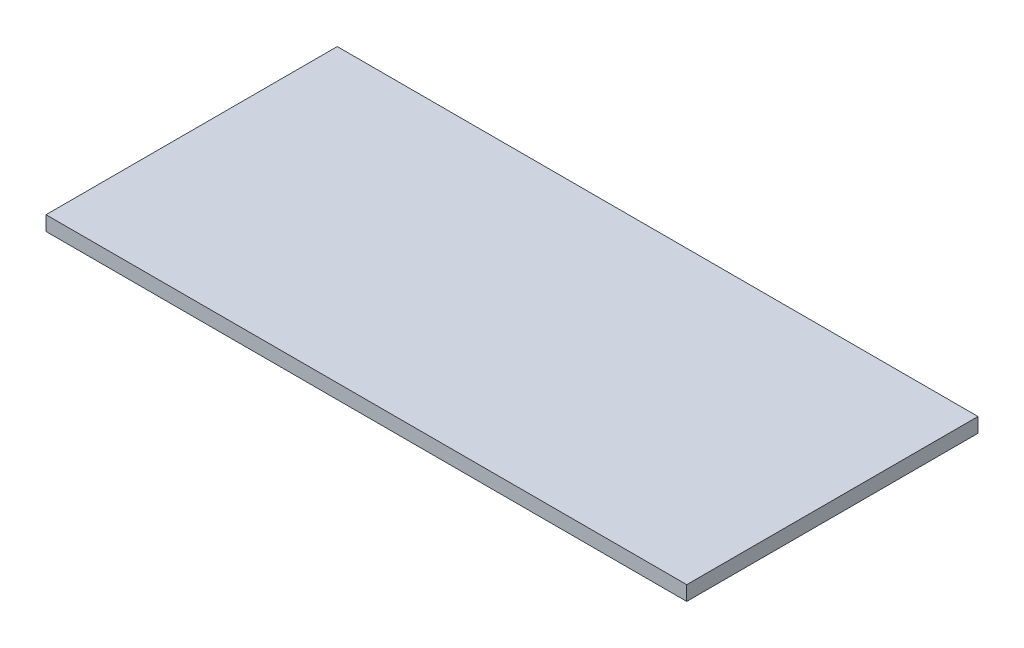
ISO-10303-21;
HEADER;
FILE_DESCRIPTION(('STEP AP214'),'2;1');
FILE_NAME('part.step','',(''),(''),'','','');
FILE_SCHEMA(('AUTOMOTIVE_DESIGN { 1 0 10303 214 1 1 1 1 }'));
ENDSEC;
DATA;
#1=APPLICATION_CONTEXT('core data for automotive mechanical design processes');
#2=APPLICATION_PROTOCOL_DEFINITION('international standard','automotive_design',2000,#1);
#3=PRODUCT_CONTEXT('',#1,'mechanical');
#4=PRODUCT('Part','Part','',(#3));
#5=PRODUCT_RELATED_PRODUCT_CATEGORY('part','',(#4));
#6=PRODUCT_DEFINITION_FORMATION('','',#4);
#7=PRODUCT_DEFINITION_CONTEXT('part definition',#1,'design');
#8=PRODUCT_DEFINITION('design','',#6,#7);
#9=PRODUCT_DEFINITION_SHAPE('','',#8);
#10=(LENGTH_UNIT() NAMED_UNIT(*) SI_UNIT(.MILLI.,.METRE.));
#11=(NAMED_UNIT(*) PLANE_ANGLE_UNIT() SI_UNIT($,.RADIAN.));
#12=(NAMED_UNIT(*) SI_UNIT($,.STERADIAN.) SOLID_ANGLE_UNIT());
#13=UNCERTAINTY_MEASURE_WITH_UNIT(LENGTH_MEASURE(1.E-05),#10,'distance_accuracy_value','');
#14=(GEOMETRIC_REPRESENTATION_CONTEXT(3) GLOBAL_UNCERTAINTY_ASSIGNED_CONTEXT((#13)) GLOBAL_UNIT_ASSIGNED_CONTEXT((#10,
#11,#12)) REPRESENTATION_CONTEXT('',''));
#15=CARTESIAN_POINT('',(0.,0.,0.));
#16=DIRECTION('',(0.,0.,1.));
#17=DIRECTION('',(1.,0.,0.));
#18=AXIS2_PLACEMENT_3D('',#15,#16,#17);
#19=CARTESIAN_POINT('',(0.,3.175,0.));
#20=DIRECTION('',(1.,0.,0.));
#21=DIRECTION('',(0.,0.,-1.));
#22=AXIS2_PLACEMENT_3D('',#19,#20,#21);
#23=PLANE('',#22);
#24=DIRECTION('',(0.,0.,1.));
#25=VECTOR('',#24,1.);
#26=CARTESIAN_POINT('',(0.,0.,0.));
#27=LINE('',#26,#25);
#28=CARTESIAN_POINT('',(0.,0.,-63.5));
#29=VERTEX_POINT('',#28);
#30=CARTESIAN_POINT('',(0.,0.,0.));
#31=VERTEX_POINT('',#30);
#32=EDGE_CURVE('E96',#29,#31,#27,.T.);
#33=ORIENTED_EDGE('',*,*,#32,.T.);
#34=DIRECTION('',(0.,-1.,0.));
#35=VECTOR('',#34,1.);
#36=CARTESIAN_POINT('',(0.,3.175,0.));
#37=LINE('',#36,#35);
#38=CARTESIAN_POINT('',(0.,3.175,0.));
#39=VERTEX_POINT('',#38);
#40=EDGE_CURVE('E11',#39,#31,#37,.T.);
#41=ORIENTED_EDGE('',*,*,#40,.F.);
#42=DIRECTION('',(0.,0.,1.));
#43=VECTOR('',#42,1.);
#44=CARTESIAN_POINT('',(0.,3.175,0.));
#45=LINE('',#44,#43);
#46=CARTESIAN_POINT('',(0.,3.175,-63.5));
#47=VERTEX_POINT('',#46);
#48=EDGE_CURVE('E84',#47,#39,#45,.T.);
#49=ORIENTED_EDGE('',*,*,#48,.F.);
#50=DIRECTION('',(0.,-1.,0.));
#51=VECTOR('',#50,1.);
#52=CARTESIAN_POINT('',(0.,3.175,-63.5));
#53=LINE('',#52,#51);
#54=EDGE_CURVE('E92',#47,#29,#53,.T.);
#55=ORIENTED_EDGE('',*,*,#54,.T.);
#56=EDGE_LOOP('',(#33,#41,#49,#55));
#57=FACE_BOUND('',#56,.T.);
#58=ADVANCED_FACE('F33',(#57),#23,.F.);
#59=CARTESIAN_POINT('',(0.,3.175,0.));
#60=DIRECTION('',(0.,0.,-1.));
#61=DIRECTION('',(-1.,0.,0.));
#62=AXIS2_PLACEMENT_3D('',#59,#60,#61);
#63=PLANE('',#62);
#64=DIRECTION('',(1.,0.,0.));
#65=VECTOR('',#64,1.);
#66=CARTESIAN_POINT('',(0.,0.,0.));
#67=LINE('',#66,#65);
#68=CARTESIAN_POINT('',(139.7,0.,0.));
#69=VERTEX_POINT('',#68);
#70=EDGE_CURVE('E88',#31,#69,#67,.T.);
#71=ORIENTED_EDGE('',*,*,#70,.T.);
#72=DIRECTION('',(0.,-1.,0.));
#73=VECTOR('',#72,1.);
#74=CARTESIAN_POINT('',(139.7,3.175,0.));
#75=LINE('',#74,#73);
#76=CARTESIAN_POINT('',(139.7,3.175,0.));
#77=VERTEX_POINT('',#76);
#78=EDGE_CURVE('E41',#77,#69,#75,.T.);
#79=ORIENTED_EDGE('',*,*,#78,.F.);
#80=DIRECTION('',(1.,0.,0.));
#81=VECTOR('',#80,1.);
#82=CARTESIAN_POINT('',(0.,3.175,0.));
#83=LINE('',#82,#81);
#84=EDGE_CURVE('E79',#39,#77,#83,.T.);
#85=ORIENTED_EDGE('',*,*,#84,.F.);
#86=ORIENTED_EDGE('',*,*,#40,.T.);
#87=EDGE_LOOP('',(#71,#79,#85,#86));
#88=FACE_BOUND('',#87,.T.);
#89=ADVANCED_FACE('F87',(#88),#63,.F.);
#90=CARTESIAN_POINT('',(139.7,3.175,0.));
#91=DIRECTION('',(-1.,0.,0.));
#92=DIRECTION('',(0.,0.,1.));
#93=AXIS2_PLACEMENT_3D('',#90,#91,#92);
#94=PLANE('',#93);
#95=DIRECTION('',(0.,0.,-1.));
#96=VECTOR('',#95,1.);
#97=CARTESIAN_POINT('',(139.7,0.,0.));
#98=LINE('',#97,#96);
#99=CARTESIAN_POINT('',(139.7,0.,-63.5));
#100=VERTEX_POINT('',#99);
#101=EDGE_CURVE('E66',#69,#100,#98,.T.);
#102=ORIENTED_EDGE('',*,*,#101,.T.);
#103=DIRECTION('',(0.,-1.,0.));
#104=VECTOR('',#103,1.);
#105=CARTESIAN_POINT('',(139.7,3.175,-63.5));
#106=LINE('',#105,#104);
#107=CARTESIAN_POINT('',(139.7,3.175,-63.5));
#108=VERTEX_POINT('',#107);
#109=EDGE_CURVE('E89',#108,#100,#106,.T.);
#110=ORIENTED_EDGE('',*,*,#109,.F.);
#111=DIRECTION('',(0.,0.,-1.));
#112=VECTOR('',#111,1.);
#113=CARTESIAN_POINT('',(139.7,3.175,0.));
#114=LINE('',#113,#112);
#115=EDGE_CURVE('E82',#77,#108,#114,.T.);
#116=ORIENTED_EDGE('',*,*,#115,.F.);
#117=ORIENTED_EDGE('',*,*,#78,.T.);
#118=EDGE_LOOP('',(#102,#110,#116,#117));
#119=FACE_BOUND('',#118,.T.);
#120=ADVANCED_FACE('F90',(#119),#94,.F.);
#121=CARTESIAN_POINT('',(0.,3.175,-63.5));
#122=DIRECTION('',(0.,0.,1.));
#123=DIRECTION('',(1.,0.,0.));
#124=AXIS2_PLACEMENT_3D('',#121,#122,#123);
#125=PLANE('',#124);
#126=DIRECTION('',(-1.,0.,0.));
#127=VECTOR('',#126,1.);
#128=CARTESIAN_POINT('',(0.,0.,-63.5));
#129=LINE('',#128,#127);
#130=EDGE_CURVE('E72',#100,#29,#129,.T.);
#131=ORIENTED_EDGE('',*,*,#130,.T.);
#132=ORIENTED_EDGE('',*,*,#54,.F.);
#133=DIRECTION('',(-1.,0.,0.));
#134=VECTOR('',#133,1.);
#135=CARTESIAN_POINT('',(0.,3.175,-63.5));
#136=LINE('',#135,#134);
#137=EDGE_CURVE('E49',#108,#47,#136,.T.);
#138=ORIENTED_EDGE('',*,*,#137,.F.);
#139=ORIENTED_EDGE('',*,*,#109,.T.);
#140=EDGE_LOOP('',(#131,#132,#138,#139));
#141=FACE_BOUND('',#140,.T.);
#142=ADVANCED_FACE('F103',(#141),#125,.F.);
#143=CARTESIAN_POINT('',(0.,3.175,0.));
#144=DIRECTION('',(0.,-1.,0.));
#145=DIRECTION('',(0.,0.,-1.));
#146=AXIS2_PLACEMENT_3D('',#143,#144,#145);
#147=PLANE('',#146);
#148=ORIENTED_EDGE('',*,*,#48,.T.);
#149=ORIENTED_EDGE('',*,*,#84,.T.);
#150=ORIENTED_EDGE('',*,*,#115,.T.);
#151=ORIENTED_EDGE('',*,*,#137,.T.);
#152=EDGE_LOOP('',(#148,#149,#150,#151));
#153=FACE_BOUND('',#152,.T.);
#154=ADVANCED_FACE('F80',(#153),#147,.F.);
#155=CARTESIAN_POINT('',(0.,0.,0.));
#156=DIRECTION('',(0.,-1.,0.));
#157=DIRECTION('',(0.,0.,-1.));
#158=AXIS2_PLACEMENT_3D('',#155,#156,#157);
#159=PLANE('',#158);
#160=ORIENTED_EDGE('',*,*,#32,.F.);
#161=ORIENTED_EDGE('',*,*,#130,.F.);
#162=ORIENTED_EDGE('',*,*,#101,.F.);
#163=ORIENTED_EDGE('',*,*,#70,.F.);
#164=EDGE_LOOP('',(#160,#161,#162,#163));
#165=FACE_BOUND('',#164,.T.);
#166=ADVANCED_FACE('F106',(#165),#159,.T.);
#167=CLOSED_SHELL('',(#58,#89,#120,#142,#154,#166));
#168=MANIFOLD_SOLID_BREP('B2',#167);
#169=ADVANCED_BREP_SHAPE_REPRESENTATION('',(#18,#168),#14);
#170=SHAPE_DEFINITION_REPRESENTATION(#9,#169);
ENDSEC;
END-ISO-10303-21;
